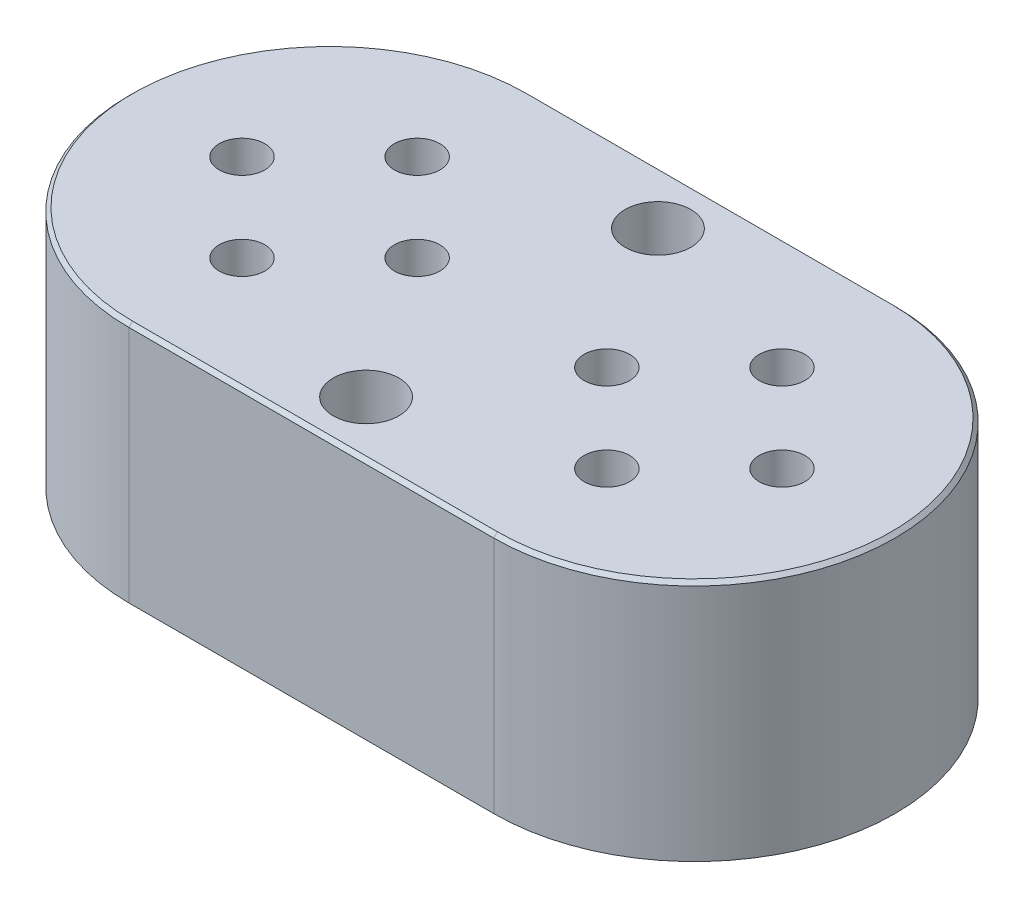
ISO-10303-21;
HEADER;
FILE_DESCRIPTION(('STEP AP214'),'2;1');
FILE_NAME('part.step','',(''),(''),'','','');
FILE_SCHEMA(('AUTOMOTIVE_DESIGN { 1 0 10303 214 1 1 1 1 }'));
ENDSEC;
DATA;
#1=APPLICATION_CONTEXT('core data for automotive mechanical design processes');
#2=APPLICATION_PROTOCOL_DEFINITION('international standard','automotive_design',2000,#1);
#3=PRODUCT_CONTEXT('',#1,'mechanical');
#4=PRODUCT('Part','Part','',(#3));
#5=PRODUCT_RELATED_PRODUCT_CATEGORY('part','',(#4));
#6=PRODUCT_DEFINITION_FORMATION('','',#4);
#7=PRODUCT_DEFINITION_CONTEXT('part definition',#1,'design');
#8=PRODUCT_DEFINITION('design','',#6,#7);
#9=PRODUCT_DEFINITION_SHAPE('','',#8);
#10=(LENGTH_UNIT() NAMED_UNIT(*) SI_UNIT(.MILLI.,.METRE.));
#11=(NAMED_UNIT(*) PLANE_ANGLE_UNIT() SI_UNIT($,.RADIAN.));
#12=(NAMED_UNIT(*) SI_UNIT($,.STERADIAN.) SOLID_ANGLE_UNIT());
#13=UNCERTAINTY_MEASURE_WITH_UNIT(LENGTH_MEASURE(1.E-05),#10,'distance_accuracy_value','');
#14=(GEOMETRIC_REPRESENTATION_CONTEXT(3) GLOBAL_UNCERTAINTY_ASSIGNED_CONTEXT((#13)) GLOBAL_UNIT_ASSIGNED_CONTEXT((#10,
#11,#12)) REPRESENTATION_CONTEXT('',''));
#15=CARTESIAN_POINT('',(0.,0.,0.));
#16=DIRECTION('',(0.,0.,1.));
#17=DIRECTION('',(1.,0.,0.));
#18=AXIS2_PLACEMENT_3D('',#15,#16,#17);
#19=CARTESIAN_POINT('',(0.,16.8656,0.));
#20=DIRECTION('',(0.,-1.,0.));
#21=DIRECTION('',(0.,0.,-1.));
#22=AXIS2_PLACEMENT_3D('',#19,#20,#21);
#23=CYLINDRICAL_SURFACE('',#22,13.97);
#24=DIRECTION('',(0.,-1.,0.));
#25=VECTOR('',#24,1.);
#26=CARTESIAN_POINT('',(0.,16.8656,13.97));
#27=LINE('',#26,#25);
#28=CARTESIAN_POINT('',(0.,16.6116,13.97));
#29=VERTEX_POINT('',#28);
#30=CARTESIAN_POINT('',(0.,0.,13.97));
#31=VERTEX_POINT('',#30);
#32=EDGE_CURVE('E90',#29,#31,#27,.T.);
#33=ORIENTED_EDGE('',*,*,#32,.F.);
#34=CARTESIAN_POINT('',(0.,16.6116,0.));
#35=DIRECTION('',(0.,1.,0.));
#36=DIRECTION('',(0.,0.,1.));
#37=AXIS2_PLACEMENT_3D('',#34,#35,#36);
#38=CIRCLE('',#37,13.97);
#39=CARTESIAN_POINT('',(0.,16.6116,-13.97));
#40=VERTEX_POINT('',#39);
#41=EDGE_CURVE('E11',#29,#40,#38,.F.);
#42=ORIENTED_EDGE('',*,*,#41,.T.);
#43=DIRECTION('',(0.,-1.,0.));
#44=VECTOR('',#43,1.);
#45=CARTESIAN_POINT('',(0.,16.8656,-13.97));
#46=LINE('',#45,#44);
#47=CARTESIAN_POINT('',(0.,0.,-13.97));
#48=VERTEX_POINT('',#47);
#49=EDGE_CURVE('E107',#40,#48,#46,.T.);
#50=ORIENTED_EDGE('',*,*,#49,.T.);
#51=CARTESIAN_POINT('',(0.,0.,0.));
#52=DIRECTION('',(0.,1.,0.));
#53=DIRECTION('',(0.,0.,1.));
#54=AXIS2_PLACEMENT_3D('',#51,#52,#53);
#55=CIRCLE('',#54,13.97);
#56=EDGE_CURVE('E103',#48,#31,#55,.T.);
#57=ORIENTED_EDGE('',*,*,#56,.T.);
#58=EDGE_LOOP('',(#33,#42,#50,#57));
#59=FACE_BOUND('',#58,.T.);
#60=ADVANCED_FACE('F38',(#59),#23,.T.);
#61=CARTESIAN_POINT('',(0.,16.8656,13.97));
#62=DIRECTION('',(0.,0.,-1.));
#63=DIRECTION('',(-1.,0.,0.));
#64=AXIS2_PLACEMENT_3D('',#61,#62,#63);
#65=PLANE('',#64);
#66=DIRECTION('',(0.,-1.,0.));
#67=VECTOR('',#66,1.);
#68=CARTESIAN_POINT('',(25.4,16.8656,13.97));
#69=LINE('',#68,#67);
#70=CARTESIAN_POINT('',(25.4,16.6116,13.97));
#71=VERTEX_POINT('',#70);
#72=CARTESIAN_POINT('',(25.4,0.,13.97));
#73=VERTEX_POINT('',#72);
#74=EDGE_CURVE('E97',#71,#73,#69,.T.);
#75=ORIENTED_EDGE('',*,*,#74,.F.);
#76=DIRECTION('',(-1.,0.,0.));
#77=VECTOR('',#76,1.);
#78=CARTESIAN_POINT('',(0.,16.6116,13.97));
#79=LINE('',#78,#77);
#80=EDGE_CURVE('E48',#71,#29,#79,.T.);
#81=ORIENTED_EDGE('',*,*,#80,.T.);
#82=ORIENTED_EDGE('',*,*,#32,.T.);
#83=DIRECTION('',(1.,0.,0.));
#84=VECTOR('',#83,1.);
#85=CARTESIAN_POINT('',(0.,0.,13.97));
#86=LINE('',#85,#84);
#87=EDGE_CURVE('E93',#31,#73,#86,.T.);
#88=ORIENTED_EDGE('',*,*,#87,.T.);
#89=EDGE_LOOP('',(#75,#81,#82,#88));
#90=FACE_BOUND('',#89,.T.);
#91=ADVANCED_FACE('F92',(#90),#65,.F.);
#92=CARTESIAN_POINT('',(25.4,16.8656,0.));
#93=DIRECTION('',(0.,-1.,0.));
#94=DIRECTION('',(0.,0.,-1.));
#95=AXIS2_PLACEMENT_3D('',#92,#93,#94);
#96=CYLINDRICAL_SURFACE('',#95,13.97);
#97=DIRECTION('',(0.,-1.,0.));
#98=VECTOR('',#97,1.);
#99=CARTESIAN_POINT('',(25.4,16.8656,-13.97));
#100=LINE('',#99,#98);
#101=CARTESIAN_POINT('',(25.4,16.6116,-13.97));
#102=VERTEX_POINT('',#101);
#103=CARTESIAN_POINT('',(25.4,0.,-13.97));
#104=VERTEX_POINT('',#103);
#105=EDGE_CURVE('E120',#102,#104,#100,.T.);
#106=ORIENTED_EDGE('',*,*,#105,.F.);
#107=CARTESIAN_POINT('',(25.4,16.6116,0.));
#108=DIRECTION('',(0.,1.,0.));
#109=DIRECTION('',(0.,0.,1.));
#110=AXIS2_PLACEMENT_3D('',#107,#108,#109);
#111=CIRCLE('',#110,13.97);
#112=EDGE_CURVE('E131',#102,#71,#111,.F.);
#113=ORIENTED_EDGE('',*,*,#112,.T.);
#114=ORIENTED_EDGE('',*,*,#74,.T.);
#115=CARTESIAN_POINT('',(25.4,0.,0.));
#116=DIRECTION('',(0.,1.,0.));
#117=DIRECTION('',(0.,0.,1.));
#118=AXIS2_PLACEMENT_3D('',#115,#116,#117);
#119=CIRCLE('',#118,13.97);
#120=EDGE_CURVE('E105',#73,#104,#119,.T.);
#121=ORIENTED_EDGE('',*,*,#120,.T.);
#122=EDGE_LOOP('',(#106,#113,#114,#121));
#123=FACE_BOUND('',#122,.T.);
#124=ADVANCED_FACE('F161',(#123),#96,.T.);
#125=CARTESIAN_POINT('',(0.,16.8656,-13.97));
#126=DIRECTION('',(0.,0.,1.));
#127=DIRECTION('',(1.,0.,0.));
#128=AXIS2_PLACEMENT_3D('',#125,#126,#127);
#129=PLANE('',#128);
#130=ORIENTED_EDGE('',*,*,#49,.F.);
#131=DIRECTION('',(1.,0.,0.));
#132=VECTOR('',#131,1.);
#133=CARTESIAN_POINT('',(25.4,16.6116,-13.97));
#134=LINE('',#133,#132);
#135=EDGE_CURVE('E134',#40,#102,#134,.T.);
#136=ORIENTED_EDGE('',*,*,#135,.T.);
#137=ORIENTED_EDGE('',*,*,#105,.T.);
#138=DIRECTION('',(-1.,0.,0.));
#139=VECTOR('',#138,1.);
#140=CARTESIAN_POINT('',(0.,0.,-13.97));
#141=LINE('',#140,#139);
#142=EDGE_CURVE('E117',#104,#48,#141,.T.);
#143=ORIENTED_EDGE('',*,*,#142,.T.);
#144=EDGE_LOOP('',(#130,#136,#137,#143));
#145=FACE_BOUND('',#144,.T.);
#146=ADVANCED_FACE('F163',(#145),#129,.F.);
#147=CARTESIAN_POINT('',(0.,16.8656,0.));
#148=DIRECTION('',(0.,1.,0.));
#149=DIRECTION('',(0.,0.,1.));
#150=AXIS2_PLACEMENT_3D('',#147,#148,#149);
#151=PLANE('',#150);
#152=CARTESIAN_POINT('',(12.7,16.8656,-10.16));
#153=DIRECTION('',(0.,1.,0.));
#154=DIRECTION('',(0.,0.,1.));
#155=AXIS2_PLACEMENT_3D('',#152,#153,#154);
#156=CIRCLE('',#155,2.286);
#157=CARTESIAN_POINT('',(12.7,16.8656,-7.874));
#158=VERTEX_POINT('',#157);
#159=EDGE_CURVE('E286',#158,#158,#156,.T.);
#160=ORIENTED_EDGE('',*,*,#159,.F.);
#161=EDGE_LOOP('',(#160));
#162=FACE_BOUND('',#161,.T.);
#163=CARTESIAN_POINT('',(12.7,16.8656,10.16));
#164=DIRECTION('',(0.,1.,0.));
#165=DIRECTION('',(0.,0.,-1.));
#166=AXIS2_PLACEMENT_3D('',#163,#164,#165);
#167=CIRCLE('',#166,2.286);
#168=CARTESIAN_POINT('',(12.7,16.8656,7.874));
#169=VERTEX_POINT('',#168);
#170=EDGE_CURVE('E292',#169,#169,#167,.T.);
#171=ORIENTED_EDGE('',*,*,#170,.F.);
#172=EDGE_LOOP('',(#171));
#173=FACE_BOUND('',#172,.T.);
#174=CARTESIAN_POINT('',(31.496,16.8656,0.));
#175=DIRECTION('',(0.,1.,0.));
#176=DIRECTION('',(0.,0.,1.));
#177=AXIS2_PLACEMENT_3D('',#174,#175,#176);
#178=CIRCLE('',#177,1.5875);
#179=CARTESIAN_POINT('',(31.496,16.8656,1.5875));
#180=VERTEX_POINT('',#179);
#181=EDGE_CURVE('E318',#180,#180,#178,.T.);
#182=ORIENTED_EDGE('',*,*,#181,.F.);
#183=EDGE_LOOP('',(#182));
#184=FACE_BOUND('',#183,.T.);
#185=CARTESIAN_POINT('',(25.4,16.8656,6.096));
#186=DIRECTION('',(0.,1.,0.));
#187=DIRECTION('',(0.,0.,1.));
#188=AXIS2_PLACEMENT_3D('',#185,#186,#187);
#189=CIRCLE('',#188,1.5875);
#190=CARTESIAN_POINT('',(25.4,16.8656,7.6835));
#191=VERTEX_POINT('',#190);
#192=EDGE_CURVE('E324',#191,#191,#189,.T.);
#193=ORIENTED_EDGE('',*,*,#192,.F.);
#194=EDGE_LOOP('',(#193));
#195=FACE_BOUND('',#194,.T.);
#196=CARTESIAN_POINT('',(19.304,16.8656,0.));
#197=DIRECTION('',(0.,1.,0.));
#198=DIRECTION('',(0.,0.,1.));
#199=AXIS2_PLACEMENT_3D('',#196,#197,#198);
#200=CIRCLE('',#199,1.5875);
#201=CARTESIAN_POINT('',(19.304,16.8656,1.5875));
#202=VERTEX_POINT('',#201);
#203=EDGE_CURVE('E330',#202,#202,#200,.T.);
#204=ORIENTED_EDGE('',*,*,#203,.F.);
#205=EDGE_LOOP('',(#204));
#206=FACE_BOUND('',#205,.T.);
#207=CARTESIAN_POINT('',(-6.096,16.8656,0.));
#208=DIRECTION('',(0.,1.,0.));
#209=DIRECTION('',(0.,0.,-1.));
#210=AXIS2_PLACEMENT_3D('',#207,#208,#209);
#211=CIRCLE('',#210,1.5875);
#212=CARTESIAN_POINT('',(-6.096,16.8656,-1.5875));
#213=VERTEX_POINT('',#212);
#214=EDGE_CURVE('E300',#213,#213,#211,.T.);
#215=ORIENTED_EDGE('',*,*,#214,.F.);
#216=EDGE_LOOP('',(#215));
#217=FACE_BOUND('',#216,.T.);
#218=CARTESIAN_POINT('',(6.096,16.8656,0.));
#219=DIRECTION('',(0.,1.,0.));
#220=DIRECTION('',(0.,0.,-1.));
#221=AXIS2_PLACEMENT_3D('',#218,#219,#220);
#222=CIRCLE('',#221,1.5875);
#223=CARTESIAN_POINT('',(6.096,16.8656,-1.5875));
#224=VERTEX_POINT('',#223);
#225=EDGE_CURVE('E301',#224,#224,#222,.T.);
#226=ORIENTED_EDGE('',*,*,#225,.F.);
#227=EDGE_LOOP('',(#226));
#228=FACE_BOUND('',#227,.T.);
#229=CARTESIAN_POINT('',(0.,16.8656,6.096));
#230=DIRECTION('',(0.,1.,0.));
#231=DIRECTION('',(0.,0.,-1.));
#232=AXIS2_PLACEMENT_3D('',#229,#230,#231);
#233=CIRCLE('',#232,1.5875);
#234=CARTESIAN_POINT('',(0.,16.8656,4.5085));
#235=VERTEX_POINT('',#234);
#236=EDGE_CURVE('E307',#235,#235,#233,.T.);
#237=ORIENTED_EDGE('',*,*,#236,.F.);
#238=EDGE_LOOP('',(#237));
#239=FACE_BOUND('',#238,.T.);
#240=CARTESIAN_POINT('',(0.,16.8656,-6.096));
#241=DIRECTION('',(0.,1.,0.));
#242=DIRECTION('',(0.,0.,-1.));
#243=AXIS2_PLACEMENT_3D('',#240,#241,#242);
#244=CIRCLE('',#243,1.5875);
#245=CARTESIAN_POINT('',(0.,16.8656,-7.6835));
#246=VERTEX_POINT('',#245);
#247=EDGE_CURVE('E289',#246,#246,#244,.T.);
#248=ORIENTED_EDGE('',*,*,#247,.F.);
#249=EDGE_LOOP('',(#248));
#250=FACE_BOUND('',#249,.T.);
#251=CARTESIAN_POINT('',(25.4,16.8656,-6.096));
#252=DIRECTION('',(0.,1.,0.));
#253=DIRECTION('',(0.,0.,1.));
#254=AXIS2_PLACEMENT_3D('',#251,#252,#253);
#255=CIRCLE('',#254,1.5875);
#256=CARTESIAN_POINT('',(25.4,16.8656,-4.5085));
#257=VERTEX_POINT('',#256);
#258=EDGE_CURVE('E113',#257,#257,#255,.T.);
#259=ORIENTED_EDGE('',*,*,#258,.F.);
#260=EDGE_LOOP('',(#259));
#261=FACE_BOUND('',#260,.T.);
#262=DIRECTION('',(1.,0.,0.));
#263=VECTOR('',#262,1.);
#264=CARTESIAN_POINT('',(25.4,16.8656,13.716));
#265=LINE('',#264,#263);
#266=CARTESIAN_POINT('',(0.,16.8656,13.716));
#267=VERTEX_POINT('',#266);
#268=CARTESIAN_POINT('',(25.4,16.8656,13.716));
#269=VERTEX_POINT('',#268);
#270=EDGE_CURVE('E124',#267,#269,#265,.T.);
#271=ORIENTED_EDGE('',*,*,#270,.T.);
#272=CARTESIAN_POINT('',(25.4,16.8656,0.));
#273=DIRECTION('',(0.,1.,0.));
#274=DIRECTION('',(0.,0.,1.));
#275=AXIS2_PLACEMENT_3D('',#272,#273,#274);
#276=CIRCLE('',#275,13.716);
#277=CARTESIAN_POINT('',(25.4,16.8656,-13.716));
#278=VERTEX_POINT('',#277);
#279=EDGE_CURVE('E128',#269,#278,#276,.T.);
#280=ORIENTED_EDGE('',*,*,#279,.T.);
#281=DIRECTION('',(-1.,0.,0.));
#282=VECTOR('',#281,1.);
#283=CARTESIAN_POINT('',(0.,16.8656,-13.716));
#284=LINE('',#283,#282);
#285=CARTESIAN_POINT('',(0.,16.8656,-13.716));
#286=VERTEX_POINT('',#285);
#287=EDGE_CURVE('E126',#278,#286,#284,.T.);
#288=ORIENTED_EDGE('',*,*,#287,.T.);
#289=CARTESIAN_POINT('',(0.,16.8656,0.));
#290=DIRECTION('',(0.,1.,0.));
#291=DIRECTION('',(0.,0.,1.));
#292=AXIS2_PLACEMENT_3D('',#289,#290,#291);
#293=CIRCLE('',#292,13.716);
#294=EDGE_CURVE('E96',#286,#267,#293,.T.);
#295=ORIENTED_EDGE('',*,*,#294,.T.);
#296=EDGE_LOOP('',(#271,#280,#288,#295));
#297=FACE_BOUND('',#296,.T.);
#298=ADVANCED_FACE('F153',(#162,#173,#184,#195,#206,#217,#228,#239,#250,#261,#297),#151,.T.);
#299=CARTESIAN_POINT('',(0.,0.,0.));
#300=DIRECTION('',(0.,1.,0.));
#301=DIRECTION('',(0.,0.,1.));
#302=AXIS2_PLACEMENT_3D('',#299,#300,#301);
#303=PLANE('',#302);
#304=CARTESIAN_POINT('',(12.7,0.,-10.16));
#305=DIRECTION('',(0.,1.,0.));
#306=DIRECTION('',(0.,0.,1.));
#307=AXIS2_PLACEMENT_3D('',#304,#305,#306);
#308=CIRCLE('',#307,2.286);
#309=CARTESIAN_POINT('',(12.7,0.,-7.874));
#310=VERTEX_POINT('',#309);
#311=EDGE_CURVE('E283',#310,#310,#308,.T.);
#312=ORIENTED_EDGE('',*,*,#311,.T.);
#313=EDGE_LOOP('',(#312));
#314=FACE_BOUND('',#313,.T.);
#315=CARTESIAN_POINT('',(12.7,0.,10.16));
#316=DIRECTION('',(0.,1.,0.));
#317=DIRECTION('',(0.,0.,-1.));
#318=AXIS2_PLACEMENT_3D('',#315,#316,#317);
#319=CIRCLE('',#318,2.286);
#320=CARTESIAN_POINT('',(12.7,0.,7.874));
#321=VERTEX_POINT('',#320);
#322=EDGE_CURVE('E287',#321,#321,#319,.T.);
#323=ORIENTED_EDGE('',*,*,#322,.T.);
#324=EDGE_LOOP('',(#323));
#325=FACE_BOUND('',#324,.T.);
#326=ORIENTED_EDGE('',*,*,#56,.F.);
#327=ORIENTED_EDGE('',*,*,#142,.F.);
#328=ORIENTED_EDGE('',*,*,#120,.F.);
#329=ORIENTED_EDGE('',*,*,#87,.F.);
#330=EDGE_LOOP('',(#326,#327,#328,#329));
#331=FACE_BOUND('',#330,.T.);
#332=ADVANCED_FACE('F101',(#314,#325,#331),#303,.F.);
#333=CARTESIAN_POINT('',(0.,16.8656,0.));
#334=DIRECTION('',(0.,-1.,0.));
#335=DIRECTION('',(0.,0.,-1.));
#336=AXIS2_PLACEMENT_3D('',#333,#334,#335);
#337=CONICAL_SURFACE('',#336,13.716,0.785398163397442);
#338=DIRECTION('',(0.,0.707106781186552,0.707106781186543));
#339=VECTOR('',#338,1.);
#340=CARTESIAN_POINT('',(0.,16.6116,-13.97));
#341=LINE('',#340,#339);
#342=EDGE_CURVE('E111',#40,#286,#341,.T.);
#343=ORIENTED_EDGE('',*,*,#342,.F.);
#344=ORIENTED_EDGE('',*,*,#41,.F.);
#345=DIRECTION('',(0.,-0.707106781186552,0.707106781186543));
#346=VECTOR('',#345,1.);
#347=CARTESIAN_POINT('',(0.,16.8656,13.716));
#348=LINE('',#347,#346);
#349=EDGE_CURVE('E43',#267,#29,#348,.T.);
#350=ORIENTED_EDGE('',*,*,#349,.F.);
#351=ORIENTED_EDGE('',*,*,#294,.F.);
#352=EDGE_LOOP('',(#343,#344,#350,#351));
#353=FACE_BOUND('',#352,.T.);
#354=ADVANCED_FACE('F41',(#353),#337,.T.);
#355=CARTESIAN_POINT('',(0.,16.8656,13.716));
#356=DIRECTION('',(0.,0.707106781186543,0.707106781186552));
#357=DIRECTION('',(-1.,0.,0.));
#358=AXIS2_PLACEMENT_3D('',#355,#356,#357);
#359=PLANE('',#358);
#360=ORIENTED_EDGE('',*,*,#349,.T.);
#361=ORIENTED_EDGE('',*,*,#80,.F.);
#362=DIRECTION('',(0.,-0.707106781186552,0.707106781186543));
#363=VECTOR('',#362,1.);
#364=CARTESIAN_POINT('',(25.4,16.8656,13.716));
#365=LINE('',#364,#363);
#366=EDGE_CURVE('E139',#269,#71,#365,.T.);
#367=ORIENTED_EDGE('',*,*,#366,.F.);
#368=ORIENTED_EDGE('',*,*,#270,.F.);
#369=EDGE_LOOP('',(#360,#361,#367,#368));
#370=FACE_BOUND('',#369,.T.);
#371=ADVANCED_FACE('F192',(#370),#359,.T.);
#372=CARTESIAN_POINT('',(0.,16.8656,-13.716));
#373=DIRECTION('',(0.,0.707106781186543,-0.707106781186552));
#374=DIRECTION('',(1.,0.,0.));
#375=AXIS2_PLACEMENT_3D('',#372,#373,#374);
#376=PLANE('',#375);
#377=ORIENTED_EDGE('',*,*,#342,.T.);
#378=ORIENTED_EDGE('',*,*,#287,.F.);
#379=DIRECTION('',(0.,0.707106781186552,0.707106781186543));
#380=VECTOR('',#379,1.);
#381=CARTESIAN_POINT('',(25.4,16.6116,-13.97));
#382=LINE('',#381,#380);
#383=EDGE_CURVE('E137',#102,#278,#382,.T.);
#384=ORIENTED_EDGE('',*,*,#383,.F.);
#385=ORIENTED_EDGE('',*,*,#135,.F.);
#386=EDGE_LOOP('',(#377,#378,#384,#385));
#387=FACE_BOUND('',#386,.T.);
#388=ADVANCED_FACE('F146',(#387),#376,.T.);
#389=CARTESIAN_POINT('',(25.4,16.8656,0.));
#390=DIRECTION('',(0.,-1.,0.));
#391=DIRECTION('',(0.,0.,-1.));
#392=AXIS2_PLACEMENT_3D('',#389,#390,#391);
#393=CONICAL_SURFACE('',#392,13.716,0.785398163397442);
#394=ORIENTED_EDGE('',*,*,#366,.T.);
#395=ORIENTED_EDGE('',*,*,#112,.F.);
#396=ORIENTED_EDGE('',*,*,#383,.T.);
#397=ORIENTED_EDGE('',*,*,#279,.F.);
#398=EDGE_LOOP('',(#394,#395,#396,#397));
#399=FACE_BOUND('',#398,.T.);
#400=ADVANCED_FACE('F157',(#399),#393,.T.);
#401=CARTESIAN_POINT('',(25.4,0.508000000000002,-6.096));
#402=DIRECTION('',(0.,1.,0.));
#403=DIRECTION('',(0.,0.,1.));
#404=AXIS2_PLACEMENT_3D('',#401,#402,#403);
#405=CYLINDRICAL_SURFACE('',#404,1.5875);
#406=CARTESIAN_POINT('',(25.4,0.508000000000002,-6.096));
#407=DIRECTION('',(0.,1.,0.));
#408=DIRECTION('',(0.,0.,1.));
#409=AXIS2_PLACEMENT_3D('',#406,#407,#408);
#410=CIRCLE('',#409,1.5875);
#411=CARTESIAN_POINT('',(25.4,0.508000000000002,-4.5085));
#412=VERTEX_POINT('',#411);
#413=EDGE_CURVE('E140',#412,#412,#410,.T.);
#414=ORIENTED_EDGE('',*,*,#413,.F.);
#415=EDGE_LOOP('',(#414));
#416=FACE_BOUND('',#415,.T.);
#417=ORIENTED_EDGE('',*,*,#258,.T.);
#418=EDGE_LOOP('',(#417));
#419=FACE_BOUND('',#418,.T.);
#420=ADVANCED_FACE('F187',(#416,#419),#405,.F.);
#421=CARTESIAN_POINT('',(25.4,0.508000000000002,-6.096));
#422=DIRECTION('',(0.,1.,0.));
#423=DIRECTION('',(0.,0.,1.));
#424=AXIS2_PLACEMENT_3D('',#421,#422,#423);
#425=PLANE('',#424);
#426=ORIENTED_EDGE('',*,*,#413,.T.);
#427=EDGE_LOOP('',(#426));
#428=FACE_BOUND('',#427,.T.);
#429=ADVANCED_FACE('F211',(#428),#425,.T.);
#430=CARTESIAN_POINT('',(0.,0.508000000000002,-6.096));
#431=DIRECTION('',(0.,1.,0.));
#432=DIRECTION('',(0.,0.,1.));
#433=AXIS2_PLACEMENT_3D('',#430,#431,#432);
#434=CYLINDRICAL_SURFACE('',#433,1.5875);
#435=CARTESIAN_POINT('',(0.,0.508000000000002,-6.096));
#436=DIRECTION('',(0.,1.,0.));
#437=DIRECTION('',(0.,0.,-1.));
#438=AXIS2_PLACEMENT_3D('',#435,#436,#437);
#439=CIRCLE('',#438,1.5875);
#440=CARTESIAN_POINT('',(0.,0.508000000000002,-7.6835));
#441=VERTEX_POINT('',#440);
#442=EDGE_CURVE('E310',#441,#441,#439,.T.);
#443=ORIENTED_EDGE('',*,*,#442,.F.);
#444=EDGE_LOOP('',(#443));
#445=FACE_BOUND('',#444,.T.);
#446=ORIENTED_EDGE('',*,*,#247,.T.);
#447=EDGE_LOOP('',(#446));
#448=FACE_BOUND('',#447,.T.);
#449=ADVANCED_FACE('F215',(#445,#448),#434,.F.);
#450=CARTESIAN_POINT('',(0.,0.508000000000002,-6.096));
#451=DIRECTION('',(0.,-1.,0.));
#452=DIRECTION('',(0.,0.,-1.));
#453=AXIS2_PLACEMENT_3D('',#450,#451,#452);
#454=PLANE('',#453);
#455=ORIENTED_EDGE('',*,*,#442,.T.);
#456=EDGE_LOOP('',(#455));
#457=FACE_BOUND('',#456,.T.);
#458=ADVANCED_FACE('F253',(#457),#454,.F.);
#459=CARTESIAN_POINT('',(0.,0.508000000000002,6.096));
#460=DIRECTION('',(0.,1.,0.));
#461=DIRECTION('',(0.,0.,1.));
#462=AXIS2_PLACEMENT_3D('',#459,#460,#461);
#463=CYLINDRICAL_SURFACE('',#462,1.5875);
#464=CARTESIAN_POINT('',(0.,0.508000000000002,6.096));
#465=DIRECTION('',(0.,1.,0.));
#466=DIRECTION('',(0.,0.,-1.));
#467=AXIS2_PLACEMENT_3D('',#464,#465,#466);
#468=CIRCLE('',#467,1.5875);
#469=CARTESIAN_POINT('',(0.,0.508000000000002,4.5085));
#470=VERTEX_POINT('',#469);
#471=EDGE_CURVE('E304',#470,#470,#468,.T.);
#472=ORIENTED_EDGE('',*,*,#471,.F.);
#473=EDGE_LOOP('',(#472));
#474=FACE_BOUND('',#473,.T.);
#475=ORIENTED_EDGE('',*,*,#236,.T.);
#476=EDGE_LOOP('',(#475));
#477=FACE_BOUND('',#476,.T.);
#478=ADVANCED_FACE('F257',(#474,#477),#463,.F.);
#479=CARTESIAN_POINT('',(0.,0.508000000000002,6.096));
#480=DIRECTION('',(0.,-1.,0.));
#481=DIRECTION('',(0.,0.,-1.));
#482=AXIS2_PLACEMENT_3D('',#479,#480,#481);
#483=PLANE('',#482);
#484=ORIENTED_EDGE('',*,*,#471,.T.);
#485=EDGE_LOOP('',(#484));
#486=FACE_BOUND('',#485,.T.);
#487=ADVANCED_FACE('F261',(#486),#483,.F.);
#488=CARTESIAN_POINT('',(6.096,0.508000000000002,0.));
#489=DIRECTION('',(0.,1.,0.));
#490=DIRECTION('',(0.,0.,1.));
#491=AXIS2_PLACEMENT_3D('',#488,#489,#490);
#492=CYLINDRICAL_SURFACE('',#491,1.5875);
#493=CARTESIAN_POINT('',(6.096,0.508000000000002,0.));
#494=DIRECTION('',(0.,1.,0.));
#495=DIRECTION('',(0.,0.,-1.));
#496=AXIS2_PLACEMENT_3D('',#493,#494,#495);
#497=CIRCLE('',#496,1.5875);
#498=CARTESIAN_POINT('',(6.096,0.508000000000002,-1.5875));
#499=VERTEX_POINT('',#498);
#500=EDGE_CURVE('E297',#499,#499,#497,.T.);
#501=ORIENTED_EDGE('',*,*,#500,.F.);
#502=EDGE_LOOP('',(#501));
#503=FACE_BOUND('',#502,.T.);
#504=ORIENTED_EDGE('',*,*,#225,.T.);
#505=EDGE_LOOP('',(#504));
#506=FACE_BOUND('',#505,.T.);
#507=ADVANCED_FACE('F265',(#503,#506),#492,.F.);
#508=CARTESIAN_POINT('',(6.096,0.508000000000002,0.));
#509=DIRECTION('',(0.,-1.,0.));
#510=DIRECTION('',(0.,0.,-1.));
#511=AXIS2_PLACEMENT_3D('',#508,#509,#510);
#512=PLANE('',#511);
#513=ORIENTED_EDGE('',*,*,#500,.T.);
#514=EDGE_LOOP('',(#513));
#515=FACE_BOUND('',#514,.T.);
#516=ADVANCED_FACE('F221',(#515),#512,.F.);
#517=CARTESIAN_POINT('',(-6.096,0.508000000000002,0.));
#518=DIRECTION('',(0.,1.,0.));
#519=DIRECTION('',(0.,0.,1.));
#520=AXIS2_PLACEMENT_3D('',#517,#518,#519);
#521=CYLINDRICAL_SURFACE('',#520,1.5875);
#522=CARTESIAN_POINT('',(-6.096,0.508000000000002,0.));
#523=DIRECTION('',(0.,1.,0.));
#524=DIRECTION('',(0.,0.,-1.));
#525=AXIS2_PLACEMENT_3D('',#522,#523,#524);
#526=CIRCLE('',#525,1.5875);
#527=CARTESIAN_POINT('',(-6.096,0.508000000000002,-1.5875));
#528=VERTEX_POINT('',#527);
#529=EDGE_CURVE('E333',#528,#528,#526,.T.);
#530=ORIENTED_EDGE('',*,*,#529,.F.);
#531=EDGE_LOOP('',(#530));
#532=FACE_BOUND('',#531,.T.);
#533=ORIENTED_EDGE('',*,*,#214,.T.);
#534=EDGE_LOOP('',(#533));
#535=FACE_BOUND('',#534,.T.);
#536=ADVANCED_FACE('F217',(#532,#535),#521,.F.);
#537=CARTESIAN_POINT('',(-6.096,0.508000000000002,0.));
#538=DIRECTION('',(0.,-1.,0.));
#539=DIRECTION('',(0.,0.,-1.));
#540=AXIS2_PLACEMENT_3D('',#537,#538,#539);
#541=PLANE('',#540);
#542=ORIENTED_EDGE('',*,*,#529,.T.);
#543=EDGE_LOOP('',(#542));
#544=FACE_BOUND('',#543,.T.);
#545=ADVANCED_FACE('F220',(#544),#541,.F.);
#546=CARTESIAN_POINT('',(19.304,0.508000000000002,0.));
#547=DIRECTION('',(0.,1.,0.));
#548=DIRECTION('',(0.,0.,1.));
#549=AXIS2_PLACEMENT_3D('',#546,#547,#548);
#550=CYLINDRICAL_SURFACE('',#549,1.5875);
#551=CARTESIAN_POINT('',(19.304,0.508000000000002,0.));
#552=DIRECTION('',(0.,1.,0.));
#553=DIRECTION('',(0.,0.,1.));
#554=AXIS2_PLACEMENT_3D('',#551,#552,#553);
#555=CIRCLE('',#554,1.5875);
#556=CARTESIAN_POINT('',(19.304,0.508000000000002,1.5875));
#557=VERTEX_POINT('',#556);
#558=EDGE_CURVE('E327',#557,#557,#555,.T.);
#559=ORIENTED_EDGE('',*,*,#558,.F.);
#560=EDGE_LOOP('',(#559));
#561=FACE_BOUND('',#560,.T.);
#562=ORIENTED_EDGE('',*,*,#203,.T.);
#563=EDGE_LOOP('',(#562));
#564=FACE_BOUND('',#563,.T.);
#565=ADVANCED_FACE('F225',(#561,#564),#550,.F.);
#566=CARTESIAN_POINT('',(19.304,0.508000000000002,0.));
#567=DIRECTION('',(0.,1.,0.));
#568=DIRECTION('',(0.,0.,1.));
#569=AXIS2_PLACEMENT_3D('',#566,#567,#568);
#570=PLANE('',#569);
#571=ORIENTED_EDGE('',*,*,#558,.T.);
#572=EDGE_LOOP('',(#571));
#573=FACE_BOUND('',#572,.T.);
#574=ADVANCED_FACE('F229',(#573),#570,.T.);
#575=CARTESIAN_POINT('',(25.4,0.508000000000002,6.096));
#576=DIRECTION('',(0.,1.,0.));
#577=DIRECTION('',(0.,0.,1.));
#578=AXIS2_PLACEMENT_3D('',#575,#576,#577);
#579=CYLINDRICAL_SURFACE('',#578,1.5875);
#580=CARTESIAN_POINT('',(25.4,0.508000000000002,6.096));
#581=DIRECTION('',(0.,1.,0.));
#582=DIRECTION('',(0.,0.,1.));
#583=AXIS2_PLACEMENT_3D('',#580,#581,#582);
#584=CIRCLE('',#583,1.5875);
#585=CARTESIAN_POINT('',(25.4,0.508000000000002,7.6835));
#586=VERTEX_POINT('',#585);
#587=EDGE_CURVE('E321',#586,#586,#584,.T.);
#588=ORIENTED_EDGE('',*,*,#587,.F.);
#589=EDGE_LOOP('',(#588));
#590=FACE_BOUND('',#589,.T.);
#591=ORIENTED_EDGE('',*,*,#192,.T.);
#592=EDGE_LOOP('',(#591));
#593=FACE_BOUND('',#592,.T.);
#594=ADVANCED_FACE('F233',(#590,#593),#579,.F.);
#595=CARTESIAN_POINT('',(25.4,0.508000000000002,6.096));
#596=DIRECTION('',(0.,1.,0.));
#597=DIRECTION('',(0.,0.,1.));
#598=AXIS2_PLACEMENT_3D('',#595,#596,#597);
#599=PLANE('',#598);
#600=ORIENTED_EDGE('',*,*,#587,.T.);
#601=EDGE_LOOP('',(#600));
#602=FACE_BOUND('',#601,.T.);
#603=ADVANCED_FACE('F237',(#602),#599,.T.);
#604=CARTESIAN_POINT('',(31.496,0.508000000000002,0.));
#605=DIRECTION('',(0.,1.,0.));
#606=DIRECTION('',(0.,0.,1.));
#607=AXIS2_PLACEMENT_3D('',#604,#605,#606);
#608=CYLINDRICAL_SURFACE('',#607,1.5875);
#609=CARTESIAN_POINT('',(31.496,0.508000000000002,0.));
#610=DIRECTION('',(0.,1.,0.));
#611=DIRECTION('',(0.,0.,1.));
#612=AXIS2_PLACEMENT_3D('',#609,#610,#611);
#613=CIRCLE('',#612,1.5875);
#614=CARTESIAN_POINT('',(31.496,0.508000000000002,1.5875));
#615=VERTEX_POINT('',#614);
#616=EDGE_CURVE('E315',#615,#615,#613,.T.);
#617=ORIENTED_EDGE('',*,*,#616,.F.);
#618=EDGE_LOOP('',(#617));
#619=FACE_BOUND('',#618,.T.);
#620=ORIENTED_EDGE('',*,*,#181,.T.);
#621=EDGE_LOOP('',(#620));
#622=FACE_BOUND('',#621,.T.);
#623=ADVANCED_FACE('F241',(#619,#622),#608,.F.);
#624=CARTESIAN_POINT('',(31.496,0.508000000000002,0.));
#625=DIRECTION('',(0.,1.,0.));
#626=DIRECTION('',(0.,0.,1.));
#627=AXIS2_PLACEMENT_3D('',#624,#625,#626);
#628=PLANE('',#627);
#629=ORIENTED_EDGE('',*,*,#616,.T.);
#630=EDGE_LOOP('',(#629));
#631=FACE_BOUND('',#630,.T.);
#632=ADVANCED_FACE('F245',(#631),#628,.T.);
#633=CARTESIAN_POINT('',(12.7,0.,10.16));
#634=DIRECTION('',(0.,1.,0.));
#635=DIRECTION('',(0.,0.,1.));
#636=AXIS2_PLACEMENT_3D('',#633,#634,#635);
#637=CYLINDRICAL_SURFACE('',#636,2.286);
#638=ORIENTED_EDGE('',*,*,#322,.F.);
#639=EDGE_LOOP('',(#638));
#640=FACE_BOUND('',#639,.T.);
#641=ORIENTED_EDGE('',*,*,#170,.T.);
#642=EDGE_LOOP('',(#641));
#643=FACE_BOUND('',#642,.T.);
#644=ADVANCED_FACE('F249',(#640,#643),#637,.F.);
#645=CARTESIAN_POINT('',(12.7,0.,-10.16));
#646=DIRECTION('',(0.,1.,0.));
#647=DIRECTION('',(0.,0.,1.));
#648=AXIS2_PLACEMENT_3D('',#645,#646,#647);
#649=CYLINDRICAL_SURFACE('',#648,2.286);
#650=ORIENTED_EDGE('',*,*,#311,.F.);
#651=EDGE_LOOP('',(#650));
#652=FACE_BOUND('',#651,.T.);
#653=ORIENTED_EDGE('',*,*,#159,.T.);
#654=EDGE_LOOP('',(#653));
#655=FACE_BOUND('',#654,.T.);
#656=ADVANCED_FACE('F275',(#652,#655),#649,.F.);
#657=CLOSED_SHELL('',(#60,#91,#124,#146,#298,#332,#354,#371,#388,#400,#420,#429,#449,#458,#478,
#487,#507,#516,#536,#545,#565,#574,#594,#603,#623,#632,#644,#656));
#658=MANIFOLD_SOLID_BREP('B2',#657);
#659=ADVANCED_BREP_SHAPE_REPRESENTATION('',(#18,#658),#14);
#660=SHAPE_DEFINITION_REPRESENTATION(#9,#659);
ENDSEC;
END-ISO-10303-21;
